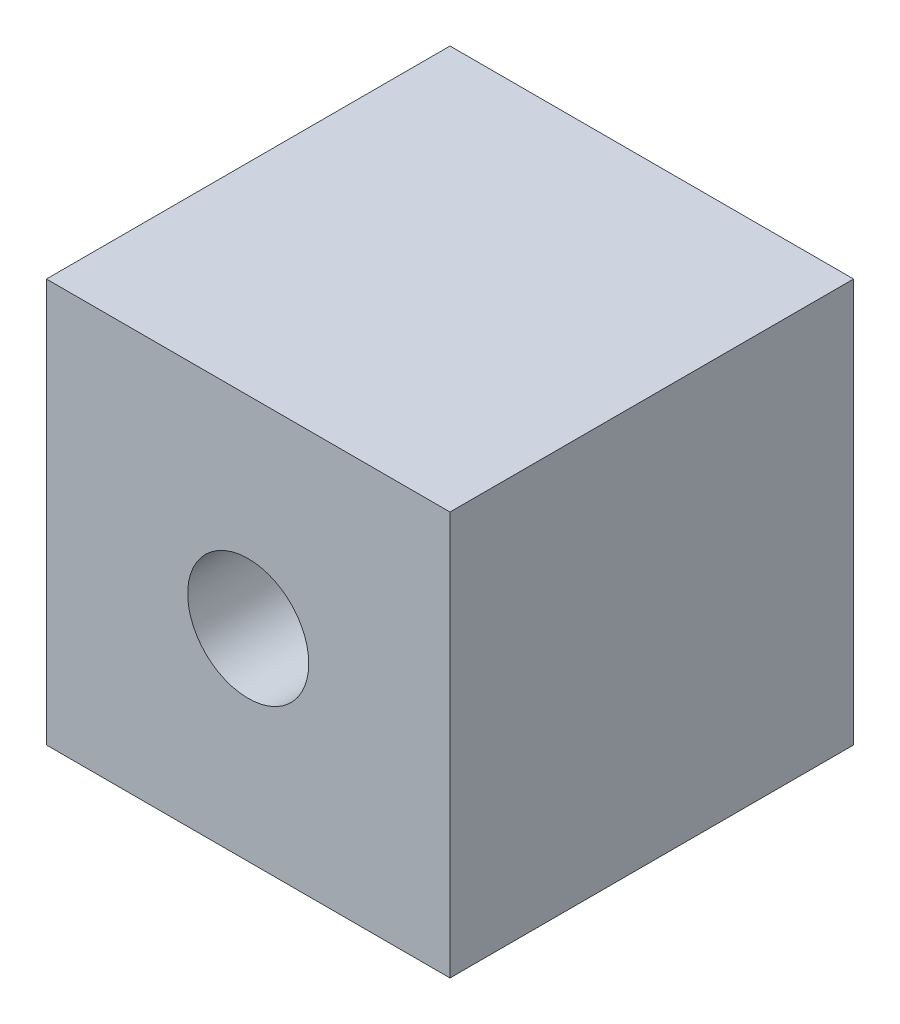
ISO-10303-21;
HEADER;
FILE_DESCRIPTION(('STEP AP214'),'2;1');
FILE_NAME('part.step','',(''),(''),'','','');
FILE_SCHEMA(('AUTOMOTIVE_DESIGN { 1 0 10303 214 1 1 1 1 }'));
ENDSEC;
DATA;
#1=APPLICATION_CONTEXT('core data for automotive mechanical design processes');
#2=APPLICATION_PROTOCOL_DEFINITION('international standard','automotive_design',2000,#1);
#3=PRODUCT_CONTEXT('',#1,'mechanical');
#4=PRODUCT('Part','Part','',(#3));
#5=PRODUCT_RELATED_PRODUCT_CATEGORY('part','',(#4));
#6=PRODUCT_DEFINITION_FORMATION('','',#4);
#7=PRODUCT_DEFINITION_CONTEXT('part definition',#1,'design');
#8=PRODUCT_DEFINITION('design','',#6,#7);
#9=PRODUCT_DEFINITION_SHAPE('','',#8);
#10=(LENGTH_UNIT() NAMED_UNIT(*) SI_UNIT(.MILLI.,.METRE.));
#11=(NAMED_UNIT(*) PLANE_ANGLE_UNIT() SI_UNIT($,.RADIAN.));
#12=(NAMED_UNIT(*) SI_UNIT($,.STERADIAN.) SOLID_ANGLE_UNIT());
#13=UNCERTAINTY_MEASURE_WITH_UNIT(LENGTH_MEASURE(1.E-05),#10,'distance_accuracy_value','');
#14=(GEOMETRIC_REPRESENTATION_CONTEXT(3) GLOBAL_UNCERTAINTY_ASSIGNED_CONTEXT((#13)) GLOBAL_UNIT_ASSIGNED_CONTEXT((#10,
#11,#12)) REPRESENTATION_CONTEXT('',''));
#15=CARTESIAN_POINT('',(0.,0.,0.));
#16=DIRECTION('',(0.,0.,1.));
#17=DIRECTION('',(1.,0.,0.));
#18=AXIS2_PLACEMENT_3D('',#15,#16,#17);
#19=CARTESIAN_POINT('',(0.,10.,10.));
#20=DIRECTION('',(0.,0.,-1.));
#21=DIRECTION('',(-1.,0.,0.));
#22=AXIS2_PLACEMENT_3D('',#19,#20,#21);
#23=PLANE('',#22);
#24=DIRECTION('',(0.,-1.,0.));
#25=VECTOR('',#24,1.);
#26=CARTESIAN_POINT('',(0.,0.,10.));
#27=LINE('',#26,#25);
#28=CARTESIAN_POINT('',(0.,10.,10.));
#29=VERTEX_POINT('',#28);
#30=CARTESIAN_POINT('',(0.,0.,10.));
#31=VERTEX_POINT('',#30);
#32=EDGE_CURVE('E87',#29,#31,#27,.T.);
#33=ORIENTED_EDGE('',*,*,#32,.T.);
#34=DIRECTION('',(1.,0.,0.));
#35=VECTOR('',#34,1.);
#36=CARTESIAN_POINT('',(0.,0.,10.));
#37=LINE('',#36,#35);
#38=CARTESIAN_POINT('',(10.,0.,10.));
#39=VERTEX_POINT('',#38);
#40=EDGE_CURVE('E82',#31,#39,#37,.T.);
#41=ORIENTED_EDGE('',*,*,#40,.T.);
#42=DIRECTION('',(0.,1.,0.));
#43=VECTOR('',#42,1.);
#44=CARTESIAN_POINT('',(10.,0.,10.));
#45=LINE('',#44,#43);
#46=CARTESIAN_POINT('',(10.,10.,10.));
#47=VERTEX_POINT('',#46);
#48=EDGE_CURVE('E85',#39,#47,#45,.T.);
#49=ORIENTED_EDGE('',*,*,#48,.T.);
#50=DIRECTION('',(-1.,0.,0.));
#51=VECTOR('',#50,1.);
#52=CARTESIAN_POINT('',(0.,10.,10.));
#53=LINE('',#52,#51);
#54=EDGE_CURVE('E52',#47,#29,#53,.T.);
#55=ORIENTED_EDGE('',*,*,#54,.T.);
#56=EDGE_LOOP('',(#33,#41,#49,#55));
#57=FACE_BOUND('',#56,.T.);
#58=CARTESIAN_POINT('',(5.,5.,10.));
#59=DIRECTION('',(0.,0.,1.));
#60=DIRECTION('',(1.,0.,0.));
#61=AXIS2_PLACEMENT_3D('',#58,#59,#60);
#62=CIRCLE('',#61,1.5);
#63=CARTESIAN_POINT('',(6.5,5.,10.));
#64=VERTEX_POINT('',#63);
#65=EDGE_CURVE('E102',#64,#64,#62,.T.);
#66=ORIENTED_EDGE('',*,*,#65,.F.);
#67=EDGE_LOOP('',(#66));
#68=FACE_BOUND('',#67,.T.);
#69=ADVANCED_FACE('F35',(#57,#68),#23,.F.);
#70=CARTESIAN_POINT('',(0.,10.,0.));
#71=DIRECTION('',(0.,0.,-1.));
#72=DIRECTION('',(-1.,0.,0.));
#73=AXIS2_PLACEMENT_3D('',#70,#71,#72);
#74=PLANE('',#73);
#75=DIRECTION('',(0.,-1.,0.));
#76=VECTOR('',#75,1.);
#77=CARTESIAN_POINT('',(0.,0.,0.));
#78=LINE('',#77,#76);
#79=CARTESIAN_POINT('',(0.,10.,0.));
#80=VERTEX_POINT('',#79);
#81=CARTESIAN_POINT('',(0.,0.,0.));
#82=VERTEX_POINT('',#81);
#83=EDGE_CURVE('E99',#80,#82,#78,.T.);
#84=ORIENTED_EDGE('',*,*,#83,.F.);
#85=DIRECTION('',(-1.,0.,0.));
#86=VECTOR('',#85,1.);
#87=CARTESIAN_POINT('',(0.,10.,0.));
#88=LINE('',#87,#86);
#89=CARTESIAN_POINT('',(10.,10.,0.));
#90=VERTEX_POINT('',#89);
#91=EDGE_CURVE('E75',#90,#80,#88,.T.);
#92=ORIENTED_EDGE('',*,*,#91,.F.);
#93=DIRECTION('',(0.,1.,0.));
#94=VECTOR('',#93,1.);
#95=CARTESIAN_POINT('',(10.,0.,0.));
#96=LINE('',#95,#94);
#97=CARTESIAN_POINT('',(10.,0.,0.));
#98=VERTEX_POINT('',#97);
#99=EDGE_CURVE('E69',#98,#90,#96,.T.);
#100=ORIENTED_EDGE('',*,*,#99,.F.);
#101=DIRECTION('',(1.,0.,0.));
#102=VECTOR('',#101,1.);
#103=CARTESIAN_POINT('',(0.,0.,0.));
#104=LINE('',#103,#102);
#105=EDGE_CURVE('E91',#82,#98,#104,.T.);
#106=ORIENTED_EDGE('',*,*,#105,.F.);
#107=EDGE_LOOP('',(#84,#92,#100,#106));
#108=FACE_BOUND('',#107,.T.);
#109=CARTESIAN_POINT('',(5.,5.,0.));
#110=DIRECTION('',(0.,0.,1.));
#111=DIRECTION('',(1.,0.,0.));
#112=AXIS2_PLACEMENT_3D('',#109,#110,#111);
#113=CIRCLE('',#112,1.5);
#114=CARTESIAN_POINT('',(6.5,5.,0.));
#115=VERTEX_POINT('',#114);
#116=EDGE_CURVE('E114',#115,#115,#113,.T.);
#117=ORIENTED_EDGE('',*,*,#116,.T.);
#118=EDGE_LOOP('',(#117));
#119=FACE_BOUND('',#118,.T.);
#120=ADVANCED_FACE('F110',(#108,#119),#74,.T.);
#121=CARTESIAN_POINT('',(0.,0.,10.));
#122=DIRECTION('',(1.,0.,0.));
#123=DIRECTION('',(0.,0.,-1.));
#124=AXIS2_PLACEMENT_3D('',#121,#122,#123);
#125=PLANE('',#124);
#126=ORIENTED_EDGE('',*,*,#83,.T.);
#127=DIRECTION('',(0.,0.,-1.));
#128=VECTOR('',#127,1.);
#129=CARTESIAN_POINT('',(0.,0.,10.));
#130=LINE('',#129,#128);
#131=EDGE_CURVE('E11',#31,#82,#130,.T.);
#132=ORIENTED_EDGE('',*,*,#131,.F.);
#133=ORIENTED_EDGE('',*,*,#32,.F.);
#134=DIRECTION('',(0.,0.,-1.));
#135=VECTOR('',#134,1.);
#136=CARTESIAN_POINT('',(0.,10.,10.));
#137=LINE('',#136,#135);
#138=EDGE_CURVE('E95',#29,#80,#137,.T.);
#139=ORIENTED_EDGE('',*,*,#138,.T.);
#140=EDGE_LOOP('',(#126,#132,#133,#139));
#141=FACE_BOUND('',#140,.T.);
#142=ADVANCED_FACE('F37',(#141),#125,.F.);
#143=CARTESIAN_POINT('',(0.,0.,10.));
#144=DIRECTION('',(0.,1.,0.));
#145=DIRECTION('',(0.,0.,1.));
#146=AXIS2_PLACEMENT_3D('',#143,#144,#145);
#147=PLANE('',#146);
#148=ORIENTED_EDGE('',*,*,#105,.T.);
#149=DIRECTION('',(0.,0.,-1.));
#150=VECTOR('',#149,1.);
#151=CARTESIAN_POINT('',(10.,0.,10.));
#152=LINE('',#151,#150);
#153=EDGE_CURVE('E44',#39,#98,#152,.T.);
#154=ORIENTED_EDGE('',*,*,#153,.F.);
#155=ORIENTED_EDGE('',*,*,#40,.F.);
#156=ORIENTED_EDGE('',*,*,#131,.T.);
#157=EDGE_LOOP('',(#148,#154,#155,#156));
#158=FACE_BOUND('',#157,.T.);
#159=ADVANCED_FACE('F90',(#158),#147,.F.);
#160=CARTESIAN_POINT('',(10.,0.,10.));
#161=DIRECTION('',(-1.,0.,0.));
#162=DIRECTION('',(0.,0.,1.));
#163=AXIS2_PLACEMENT_3D('',#160,#161,#162);
#164=PLANE('',#163);
#165=ORIENTED_EDGE('',*,*,#99,.T.);
#166=DIRECTION('',(0.,0.,-1.));
#167=VECTOR('',#166,1.);
#168=CARTESIAN_POINT('',(10.,10.,10.));
#169=LINE('',#168,#167);
#170=EDGE_CURVE('E92',#47,#90,#169,.T.);
#171=ORIENTED_EDGE('',*,*,#170,.F.);
#172=ORIENTED_EDGE('',*,*,#48,.F.);
#173=ORIENTED_EDGE('',*,*,#153,.T.);
#174=EDGE_LOOP('',(#165,#171,#172,#173));
#175=FACE_BOUND('',#174,.T.);
#176=ADVANCED_FACE('F93',(#175),#164,.F.);
#177=CARTESIAN_POINT('',(0.,10.,10.));
#178=DIRECTION('',(0.,-1.,0.));
#179=DIRECTION('',(0.,0.,-1.));
#180=AXIS2_PLACEMENT_3D('',#177,#178,#179);
#181=PLANE('',#180);
#182=ORIENTED_EDGE('',*,*,#91,.T.);
#183=ORIENTED_EDGE('',*,*,#138,.F.);
#184=ORIENTED_EDGE('',*,*,#54,.F.);
#185=ORIENTED_EDGE('',*,*,#170,.T.);
#186=EDGE_LOOP('',(#182,#183,#184,#185));
#187=FACE_BOUND('',#186,.T.);
#188=ADVANCED_FACE('F107',(#187),#181,.F.);
#189=CARTESIAN_POINT('',(5.,5.,10.));
#190=DIRECTION('',(0.,0.,-1.));
#191=DIRECTION('',(-1.,0.,0.));
#192=AXIS2_PLACEMENT_3D('',#189,#190,#191);
#193=CYLINDRICAL_SURFACE('',#192,1.5);
#194=ORIENTED_EDGE('',*,*,#65,.T.);
#195=EDGE_LOOP('',(#194));
#196=FACE_BOUND('',#195,.T.);
#197=ORIENTED_EDGE('',*,*,#116,.F.);
#198=EDGE_LOOP('',(#197));
#199=FACE_BOUND('',#198,.T.);
#200=ADVANCED_FACE('F120',(#196,#199),#193,.F.);
#201=CLOSED_SHELL('',(#69,#120,#142,#159,#176,#188,#200));
#202=MANIFOLD_SOLID_BREP('B2',#201);
#203=ADVANCED_BREP_SHAPE_REPRESENTATION('',(#18,#202),#14);
#204=SHAPE_DEFINITION_REPRESENTATION(#9,#203);
ENDSEC;
END-ISO-10303-21;
